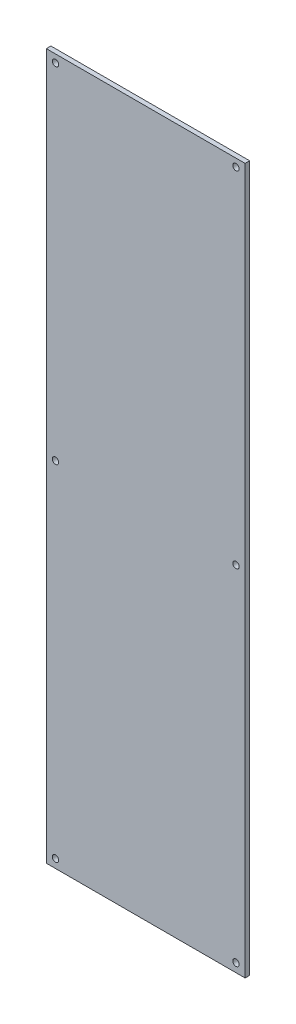
ISO-10303-21;
HEADER;
FILE_DESCRIPTION(('STEP AP214'),'2;1');
FILE_NAME('part.step','',(''),(''),'','','');
FILE_SCHEMA(('AUTOMOTIVE_DESIGN { 1 0 10303 214 1 1 1 1 }'));
ENDSEC;
DATA;
#1=APPLICATION_CONTEXT('core data for automotive mechanical design processes');
#2=APPLICATION_PROTOCOL_DEFINITION('international standard','automotive_design',2000,#1);
#3=PRODUCT_CONTEXT('',#1,'mechanical');
#4=PRODUCT('Part','Part','',(#3));
#5=PRODUCT_RELATED_PRODUCT_CATEGORY('part','',(#4));
#6=PRODUCT_DEFINITION_FORMATION('','',#4);
#7=PRODUCT_DEFINITION_CONTEXT('part definition',#1,'design');
#8=PRODUCT_DEFINITION('design','',#6,#7);
#9=PRODUCT_DEFINITION_SHAPE('','',#8);
#10=(LENGTH_UNIT() NAMED_UNIT(*) SI_UNIT(.MILLI.,.METRE.));
#11=(NAMED_UNIT(*) PLANE_ANGLE_UNIT() SI_UNIT($,.RADIAN.));
#12=(NAMED_UNIT(*) SI_UNIT($,.STERADIAN.) SOLID_ANGLE_UNIT());
#13=UNCERTAINTY_MEASURE_WITH_UNIT(LENGTH_MEASURE(1.E-05),#10,'distance_accuracy_value','');
#14=(GEOMETRIC_REPRESENTATION_CONTEXT(3) GLOBAL_UNCERTAINTY_ASSIGNED_CONTEXT((#13)) GLOBAL_UNIT_ASSIGNED_CONTEXT((#10,
#11,#12)) REPRESENTATION_CONTEXT('',''));
#15=CARTESIAN_POINT('',(0.,0.,0.));
#16=DIRECTION('',(0.,0.,1.));
#17=DIRECTION('',(1.,0.,0.));
#18=AXIS2_PLACEMENT_3D('',#15,#16,#17);
#19=CARTESIAN_POINT('',(204.249999999999,471.5,-4.9999999999999));
#20=DIRECTION('',(0.,0.,-1.));
#21=DIRECTION('',(1.,0.,0.));
#22=AXIS2_PLACEMENT_3D('',#19,#20,#21);
#23=PLANE('',#22);
#24=CARTESIAN_POINT('',(303.,94.9999999999997,-4.99999999999981));
#25=DIRECTION('',(0.,0.,-1.));
#26=DIRECTION('',(1.,0.,0.));
#27=AXIS2_PLACEMENT_3D('',#24,#25,#26);
#28=CIRCLE('',#27,3.50000000000001);
#29=CARTESIAN_POINT('',(306.5,94.9999999999997,-4.9999999999998));
#30=VERTEX_POINT('',#29);
#31=EDGE_CURVE('E98',#30,#30,#28,.T.);
#32=ORIENTED_EDGE('',*,*,#31,.F.);
#33=EDGE_LOOP('',(#32));
#34=FACE_BOUND('',#33,.T.);
#35=CARTESIAN_POINT('',(105.499999999999,472.,-4.99999999999996));
#36=DIRECTION('',(0.,0.,-1.));
#37=DIRECTION('',(1.,0.,0.));
#38=AXIS2_PLACEMENT_3D('',#35,#36,#37);
#39=CIRCLE('',#38,3.50000000000001);
#40=CARTESIAN_POINT('',(108.999999999999,472.,-4.99999999999996));
#41=VERTEX_POINT('',#40);
#42=EDGE_CURVE('E101',#41,#41,#39,.T.);
#43=ORIENTED_EDGE('',*,*,#42,.F.);
#44=EDGE_LOOP('',(#43));
#45=FACE_BOUND('',#44,.T.);
#46=CARTESIAN_POINT('',(302.999999999999,472.,-4.99999999999982));
#47=DIRECTION('',(0.,0.,-1.));
#48=DIRECTION('',(1.,0.,0.));
#49=AXIS2_PLACEMENT_3D('',#46,#47,#48);
#50=CIRCLE('',#49,3.50000000000001);
#51=CARTESIAN_POINT('',(306.499999999999,472.,-4.99999999999982));
#52=VERTEX_POINT('',#51);
#53=EDGE_CURVE('E105',#52,#52,#50,.T.);
#54=ORIENTED_EDGE('',*,*,#53,.F.);
#55=EDGE_LOOP('',(#54));
#56=FACE_BOUND('',#55,.T.);
#57=CARTESIAN_POINT('',(105.499999999999,849.,-4.99999999999998));
#58=DIRECTION('',(0.,0.,-1.));
#59=DIRECTION('',(1.,0.,0.));
#60=AXIS2_PLACEMENT_3D('',#57,#58,#59);
#61=CIRCLE('',#60,3.50000000000001);
#62=CARTESIAN_POINT('',(108.999999999999,849.,-4.99999999999998));
#63=VERTEX_POINT('',#62);
#64=EDGE_CURVE('E108',#63,#63,#61,.T.);
#65=ORIENTED_EDGE('',*,*,#64,.F.);
#66=EDGE_LOOP('',(#65));
#67=FACE_BOUND('',#66,.T.);
#68=CARTESIAN_POINT('',(105.499999999999,94.9999999999999,-4.99999999999995));
#69=DIRECTION('',(0.,0.,-1.));
#70=DIRECTION('',(1.,0.,0.));
#71=AXIS2_PLACEMENT_3D('',#68,#69,#70);
#72=CIRCLE('',#71,3.50000000000001);
#73=CARTESIAN_POINT('',(108.999999999999,94.9999999999999,-4.99999999999995));
#74=VERTEX_POINT('',#73);
#75=EDGE_CURVE('E102',#74,#74,#72,.T.);
#76=ORIENTED_EDGE('',*,*,#75,.F.);
#77=EDGE_LOOP('',(#76));
#78=FACE_BOUND('',#77,.T.);
#79=CARTESIAN_POINT('',(302.999999999999,849.,-4.99999999999983));
#80=DIRECTION('',(0.,0.,-1.));
#81=DIRECTION('',(1.,0.,0.));
#82=AXIS2_PLACEMENT_3D('',#79,#80,#81);
#83=CIRCLE('',#82,3.50000000000001);
#84=CARTESIAN_POINT('',(306.499999999999,849.,-4.99999999999983));
#85=VERTEX_POINT('',#84);
#86=EDGE_CURVE('E110',#85,#85,#83,.T.);
#87=ORIENTED_EDGE('',*,*,#86,.F.);
#88=EDGE_LOOP('',(#87));
#89=FACE_BOUND('',#88,.T.);
#90=DIRECTION('',(1.,0.,0.));
#91=VECTOR('',#90,1.);
#92=CARTESIAN_POINT('',(312.999999999999,85.5000000000005,-4.99999999999983));
#93=LINE('',#92,#91);
#94=CARTESIAN_POINT('',(95.4999999999994,85.5000000000003,-4.99999999999996));
#95=VERTEX_POINT('',#94);
#96=CARTESIAN_POINT('',(313.,85.5000000000005,-4.9999999999998));
#97=VERTEX_POINT('',#96);
#98=EDGE_CURVE('E77',#95,#97,#93,.T.);
#99=ORIENTED_EDGE('',*,*,#98,.F.);
#100=DIRECTION('',(0.,-1.,0.));
#101=VECTOR('',#100,1.);
#102=CARTESIAN_POINT('',(95.4999999999987,857.5,-4.99999999999998));
#103=LINE('',#102,#101);
#104=CARTESIAN_POINT('',(95.4999999999987,857.5,-4.99999999999998));
#105=VERTEX_POINT('',#104);
#106=EDGE_CURVE('E42',#105,#95,#103,.T.);
#107=ORIENTED_EDGE('',*,*,#106,.F.);
#108=DIRECTION('',(-1.,0.,0.));
#109=VECTOR('',#108,1.);
#110=CARTESIAN_POINT('',(312.999999999999,857.5,-4.99999999999985));
#111=LINE('',#110,#109);
#112=CARTESIAN_POINT('',(312.999999999999,857.5,-4.99999999999983));
#113=VERTEX_POINT('',#112);
#114=EDGE_CURVE('E64',#113,#105,#111,.T.);
#115=ORIENTED_EDGE('',*,*,#114,.F.);
#116=DIRECTION('',(0.,1.,0.));
#117=VECTOR('',#116,1.);
#118=CARTESIAN_POINT('',(312.999999999999,857.5,-4.99999999999983));
#119=LINE('',#118,#117);
#120=EDGE_CURVE('E95',#97,#113,#119,.T.);
#121=ORIENTED_EDGE('',*,*,#120,.F.);
#122=EDGE_LOOP('',(#99,#107,#115,#121));
#123=FACE_BOUND('',#122,.T.);
#124=ADVANCED_FACE('F16',(#34,#45,#56,#67,#78,#89,#123),#23,.T.);
#125=CARTESIAN_POINT('',(95.4999999999987,857.5,-4.99999999999998));
#126=DIRECTION('',(-1.,0.,0.));
#127=DIRECTION('',(0.,0.,-1.));
#128=AXIS2_PLACEMENT_3D('',#125,#126,#127);
#129=PLANE('',#128);
#130=DIRECTION('',(0.,-1.,0.));
#131=VECTOR('',#130,1.);
#132=CARTESIAN_POINT('',(95.4999999999987,857.5,0.));
#133=LINE('',#132,#131);
#134=CARTESIAN_POINT('',(95.4999999999987,857.5,0.));
#135=VERTEX_POINT('',#134);
#136=CARTESIAN_POINT('',(95.4999999999994,85.5000000000003,0.));
#137=VERTEX_POINT('',#136);
#138=EDGE_CURVE('E66',#135,#137,#133,.T.);
#139=ORIENTED_EDGE('',*,*,#138,.F.);
#140=DIRECTION('',(0.,0.,1.));
#141=VECTOR('',#140,1.);
#142=CARTESIAN_POINT('',(95.4999999999987,857.5,-4.99999999999998));
#143=LINE('',#142,#141);
#144=EDGE_CURVE('E11',#105,#135,#143,.T.);
#145=ORIENTED_EDGE('',*,*,#144,.F.);
#146=ORIENTED_EDGE('',*,*,#106,.T.);
#147=DIRECTION('',(0.,0.,1.));
#148=VECTOR('',#147,1.);
#149=CARTESIAN_POINT('',(95.4999999999994,85.5000000000003,-4.99999999999996));
#150=LINE('',#149,#148);
#151=EDGE_CURVE('E68',#95,#137,#150,.T.);
#152=ORIENTED_EDGE('',*,*,#151,.T.);
#153=EDGE_LOOP('',(#139,#145,#146,#152));
#154=FACE_BOUND('',#153,.T.);
#155=ADVANCED_FACE('F67',(#154),#129,.T.);
#156=CARTESIAN_POINT('',(312.999999999999,857.5,-4.99999999999985));
#157=DIRECTION('',(0.,1.,0.));
#158=DIRECTION('',(0.,0.,-1.));
#159=AXIS2_PLACEMENT_3D('',#156,#157,#158);
#160=PLANE('',#159);
#161=DIRECTION('',(-1.,0.,0.));
#162=VECTOR('',#161,1.);
#163=CARTESIAN_POINT('',(312.999999999999,857.5,1.49186218934005E-13));
#164=LINE('',#163,#162);
#165=CARTESIAN_POINT('',(312.999999999999,857.5,1.74339709335669E-13));
#166=VERTEX_POINT('',#165);
#167=EDGE_CURVE('E62',#166,#135,#164,.T.);
#168=ORIENTED_EDGE('',*,*,#167,.F.);
#169=DIRECTION('',(0.,0.,1.));
#170=VECTOR('',#169,1.);
#171=CARTESIAN_POINT('',(312.999999999999,857.5,-4.99999999999983));
#172=LINE('',#171,#170);
#173=EDGE_CURVE('E25',#113,#166,#172,.T.);
#174=ORIENTED_EDGE('',*,*,#173,.F.);
#175=ORIENTED_EDGE('',*,*,#114,.T.);
#176=ORIENTED_EDGE('',*,*,#144,.T.);
#177=EDGE_LOOP('',(#168,#174,#175,#176));
#178=FACE_BOUND('',#177,.T.);
#179=ADVANCED_FACE('F60',(#178),#160,.T.);
#180=CARTESIAN_POINT('',(312.999999999999,857.5,-4.99999999999983));
#181=DIRECTION('',(1.,0.,0.));
#182=DIRECTION('',(0.,0.,1.));
#183=AXIS2_PLACEMENT_3D('',#180,#181,#182);
#184=PLANE('',#183);
#185=DIRECTION('',(0.,1.,0.));
#186=VECTOR('',#185,1.);
#187=CARTESIAN_POINT('',(312.999999999999,857.5,1.74339709335669E-13));
#188=LINE('',#187,#186);
#189=CARTESIAN_POINT('',(313.,85.5000000000005,1.99493199737333E-13));
#190=VERTEX_POINT('',#189);
#191=EDGE_CURVE('E33',#190,#166,#188,.T.);
#192=ORIENTED_EDGE('',*,*,#191,.F.);
#193=DIRECTION('',(0.,0.,1.));
#194=VECTOR('',#193,1.);
#195=CARTESIAN_POINT('',(313.,85.5000000000005,-4.9999999999998));
#196=LINE('',#195,#194);
#197=EDGE_CURVE('E83',#97,#190,#196,.T.);
#198=ORIENTED_EDGE('',*,*,#197,.F.);
#199=ORIENTED_EDGE('',*,*,#120,.T.);
#200=ORIENTED_EDGE('',*,*,#173,.T.);
#201=EDGE_LOOP('',(#192,#198,#199,#200));
#202=FACE_BOUND('',#201,.T.);
#203=ADVANCED_FACE('F129',(#202),#184,.T.);
#204=CARTESIAN_POINT('',(312.999999999999,85.5000000000005,-4.99999999999983));
#205=DIRECTION('',(0.,-1.,0.));
#206=DIRECTION('',(0.,0.,1.));
#207=AXIS2_PLACEMENT_3D('',#204,#205,#206);
#208=PLANE('',#207);
#209=DIRECTION('',(1.,0.,0.));
#210=VECTOR('',#209,1.);
#211=CARTESIAN_POINT('',(312.999999999999,85.5000000000005,1.75207071073658E-13));
#212=LINE('',#211,#210);
#213=EDGE_CURVE('E72',#137,#190,#212,.T.);
#214=ORIENTED_EDGE('',*,*,#213,.F.);
#215=ORIENTED_EDGE('',*,*,#151,.F.);
#216=ORIENTED_EDGE('',*,*,#98,.T.);
#217=ORIENTED_EDGE('',*,*,#197,.T.);
#218=EDGE_LOOP('',(#214,#215,#216,#217));
#219=FACE_BOUND('',#218,.T.);
#220=ADVANCED_FACE('F127',(#219),#208,.T.);
#221=CARTESIAN_POINT('',(204.249999999999,471.5,0.));
#222=DIRECTION('',(0.,0.,-1.));
#223=DIRECTION('',(1.,0.,0.));
#224=AXIS2_PLACEMENT_3D('',#221,#222,#223);
#225=PLANE('',#224);
#226=CARTESIAN_POINT('',(303.,94.9999999999997,1.93421667571414E-13));
#227=DIRECTION('',(0.,0.,-1.));
#228=DIRECTION('',(1.,0.,0.));
#229=AXIS2_PLACEMENT_3D('',#226,#227,#228);
#230=CIRCLE('',#229,3.50000000000001);
#231=CARTESIAN_POINT('',(306.5,94.9999999999997,1.95554428823261E-13));
#232=VERTEX_POINT('',#231);
#233=EDGE_CURVE('E73',#232,#232,#230,.T.);
#234=ORIENTED_EDGE('',*,*,#233,.T.);
#235=EDGE_LOOP('',(#234));
#236=FACE_BOUND('',#235,.T.);
#237=CARTESIAN_POINT('',(105.499999999999,472.,0.));
#238=DIRECTION('',(0.,0.,-1.));
#239=DIRECTION('',(1.,0.,0.));
#240=AXIS2_PLACEMENT_3D('',#237,#238,#239);
#241=CIRCLE('',#240,3.50000000000001);
#242=CARTESIAN_POINT('',(108.999999999999,472.,0.));
#243=VERTEX_POINT('',#242);
#244=EDGE_CURVE('E91',#243,#243,#241,.T.);
#245=ORIENTED_EDGE('',*,*,#244,.T.);
#246=EDGE_LOOP('',(#245));
#247=FACE_BOUND('',#246,.T.);
#248=CARTESIAN_POINT('',(302.999999999999,472.,1.80411241501588E-13));
#249=DIRECTION('',(0.,0.,-1.));
#250=DIRECTION('',(1.,0.,0.));
#251=AXIS2_PLACEMENT_3D('',#248,#249,#250);
#252=CIRCLE('',#251,3.50000000000001);
#253=CARTESIAN_POINT('',(306.499999999999,472.,1.82544002753435E-13));
#254=VERTEX_POINT('',#253);
#255=EDGE_CURVE('E90',#254,#254,#252,.T.);
#256=ORIENTED_EDGE('',*,*,#255,.T.);
#257=EDGE_LOOP('',(#256));
#258=FACE_BOUND('',#257,.T.);
#259=CARTESIAN_POINT('',(105.499999999999,849.,0.));
#260=DIRECTION('',(0.,0.,-1.));
#261=DIRECTION('',(1.,0.,0.));
#262=AXIS2_PLACEMENT_3D('',#259,#260,#261);
#263=CIRCLE('',#262,3.50000000000001);
#264=CARTESIAN_POINT('',(108.999999999999,849.,0.));
#265=VERTEX_POINT('',#264);
#266=EDGE_CURVE('E87',#265,#265,#263,.T.);
#267=ORIENTED_EDGE('',*,*,#266,.T.);
#268=EDGE_LOOP('',(#267));
#269=FACE_BOUND('',#268,.T.);
#270=CARTESIAN_POINT('',(105.499999999999,94.9999999999999,0.));
#271=DIRECTION('',(0.,0.,-1.));
#272=DIRECTION('',(1.,0.,0.));
#273=AXIS2_PLACEMENT_3D('',#270,#271,#272);
#274=CIRCLE('',#273,3.50000000000001);
#275=CARTESIAN_POINT('',(108.999999999999,94.9999999999999,0.));
#276=VERTEX_POINT('',#275);
#277=EDGE_CURVE('E84',#276,#276,#274,.T.);
#278=ORIENTED_EDGE('',*,*,#277,.T.);
#279=EDGE_LOOP('',(#278));
#280=FACE_BOUND('',#279,.T.);
#281=CARTESIAN_POINT('',(302.999999999999,849.,1.6826817716975E-13));
#282=DIRECTION('',(0.,0.,-1.));
#283=DIRECTION('',(1.,0.,0.));
#284=AXIS2_PLACEMENT_3D('',#281,#282,#283);
#285=CIRCLE('',#284,3.50000000000001);
#286=CARTESIAN_POINT('',(306.499999999999,849.,1.70400938421597E-13));
#287=VERTEX_POINT('',#286);
#288=EDGE_CURVE('E20',#287,#287,#285,.T.);
#289=ORIENTED_EDGE('',*,*,#288,.T.);
#290=EDGE_LOOP('',(#289));
#291=FACE_BOUND('',#290,.T.);
#292=ORIENTED_EDGE('',*,*,#138,.T.);
#293=ORIENTED_EDGE('',*,*,#213,.T.);
#294=ORIENTED_EDGE('',*,*,#191,.T.);
#295=ORIENTED_EDGE('',*,*,#167,.T.);
#296=EDGE_LOOP('',(#292,#293,#294,#295));
#297=FACE_BOUND('',#296,.T.);
#298=ADVANCED_FACE('F75',(#236,#247,#258,#269,#280,#291,#297),#225,.F.);
#299=CARTESIAN_POINT('',(302.999999999999,849.,5.00000000000017));
#300=DIRECTION('',(0.,0.,-1.));
#301=DIRECTION('',(1.,0.,0.));
#302=AXIS2_PLACEMENT_3D('',#299,#300,#301);
#303=CYLINDRICAL_SURFACE('',#302,3.50000000000001);
#304=ORIENTED_EDGE('',*,*,#86,.T.);
#305=EDGE_LOOP('',(#304));
#306=FACE_BOUND('',#305,.T.);
#307=ORIENTED_EDGE('',*,*,#288,.F.);
#308=EDGE_LOOP('',(#307));
#309=FACE_BOUND('',#308,.T.);
#310=ADVANCED_FACE('F151',(#306,#309),#303,.F.);
#311=CARTESIAN_POINT('',(105.499999999999,94.9999999999999,5.00000000000005));
#312=DIRECTION('',(0.,0.,-1.));
#313=DIRECTION('',(1.,0.,0.));
#314=AXIS2_PLACEMENT_3D('',#311,#312,#313);
#315=CYLINDRICAL_SURFACE('',#314,3.50000000000001);
#316=ORIENTED_EDGE('',*,*,#75,.T.);
#317=EDGE_LOOP('',(#316));
#318=FACE_BOUND('',#317,.T.);
#319=ORIENTED_EDGE('',*,*,#277,.F.);
#320=EDGE_LOOP('',(#319));
#321=FACE_BOUND('',#320,.T.);
#322=ADVANCED_FACE('F158',(#318,#321),#315,.F.);
#323=CARTESIAN_POINT('',(105.499999999999,849.,5.00000000000002));
#324=DIRECTION('',(0.,0.,-1.));
#325=DIRECTION('',(1.,0.,0.));
#326=AXIS2_PLACEMENT_3D('',#323,#324,#325);
#327=CYLINDRICAL_SURFACE('',#326,3.50000000000001);
#328=ORIENTED_EDGE('',*,*,#64,.T.);
#329=EDGE_LOOP('',(#328));
#330=FACE_BOUND('',#329,.T.);
#331=ORIENTED_EDGE('',*,*,#266,.F.);
#332=EDGE_LOOP('',(#331));
#333=FACE_BOUND('',#332,.T.);
#334=ADVANCED_FACE('F154',(#330,#333),#327,.F.);
#335=CARTESIAN_POINT('',(302.999999999999,472.,5.00000000000018));
#336=DIRECTION('',(0.,0.,-1.));
#337=DIRECTION('',(1.,0.,0.));
#338=AXIS2_PLACEMENT_3D('',#335,#336,#337);
#339=CYLINDRICAL_SURFACE('',#338,3.50000000000001);
#340=ORIENTED_EDGE('',*,*,#53,.T.);
#341=EDGE_LOOP('',(#340));
#342=FACE_BOUND('',#341,.T.);
#343=ORIENTED_EDGE('',*,*,#255,.F.);
#344=EDGE_LOOP('',(#343));
#345=FACE_BOUND('',#344,.T.);
#346=ADVANCED_FACE('F157',(#342,#345),#339,.F.);
#347=CARTESIAN_POINT('',(105.499999999999,472.,5.00000000000004));
#348=DIRECTION('',(0.,0.,-1.));
#349=DIRECTION('',(1.,0.,0.));
#350=AXIS2_PLACEMENT_3D('',#347,#348,#349);
#351=CYLINDRICAL_SURFACE('',#350,3.50000000000001);
#352=ORIENTED_EDGE('',*,*,#42,.T.);
#353=EDGE_LOOP('',(#352));
#354=FACE_BOUND('',#353,.T.);
#355=ORIENTED_EDGE('',*,*,#244,.F.);
#356=EDGE_LOOP('',(#355));
#357=FACE_BOUND('',#356,.T.);
#358=ADVANCED_FACE('F159',(#354,#357),#351,.F.);
#359=CARTESIAN_POINT('',(303.,94.9999999999997,5.00000000000019));
#360=DIRECTION('',(0.,0.,-1.));
#361=DIRECTION('',(1.,0.,0.));
#362=AXIS2_PLACEMENT_3D('',#359,#360,#361);
#363=CYLINDRICAL_SURFACE('',#362,3.50000000000001);
#364=ORIENTED_EDGE('',*,*,#31,.T.);
#365=EDGE_LOOP('',(#364));
#366=FACE_BOUND('',#365,.T.);
#367=ORIENTED_EDGE('',*,*,#233,.F.);
#368=EDGE_LOOP('',(#367));
#369=FACE_BOUND('',#368,.T.);
#370=ADVANCED_FACE('F18',(#366,#369),#363,.F.);
#371=CLOSED_SHELL('',(#124,#155,#179,#203,#220,#298,#310,#322,#334,#346,#358,#370));
#372=MANIFOLD_SOLID_BREP('B1',#371);
#373=ADVANCED_BREP_SHAPE_REPRESENTATION('',(#18,#372),#14);
#374=SHAPE_DEFINITION_REPRESENTATION(#9,#373);
ENDSEC;
END-ISO-10303-21;
